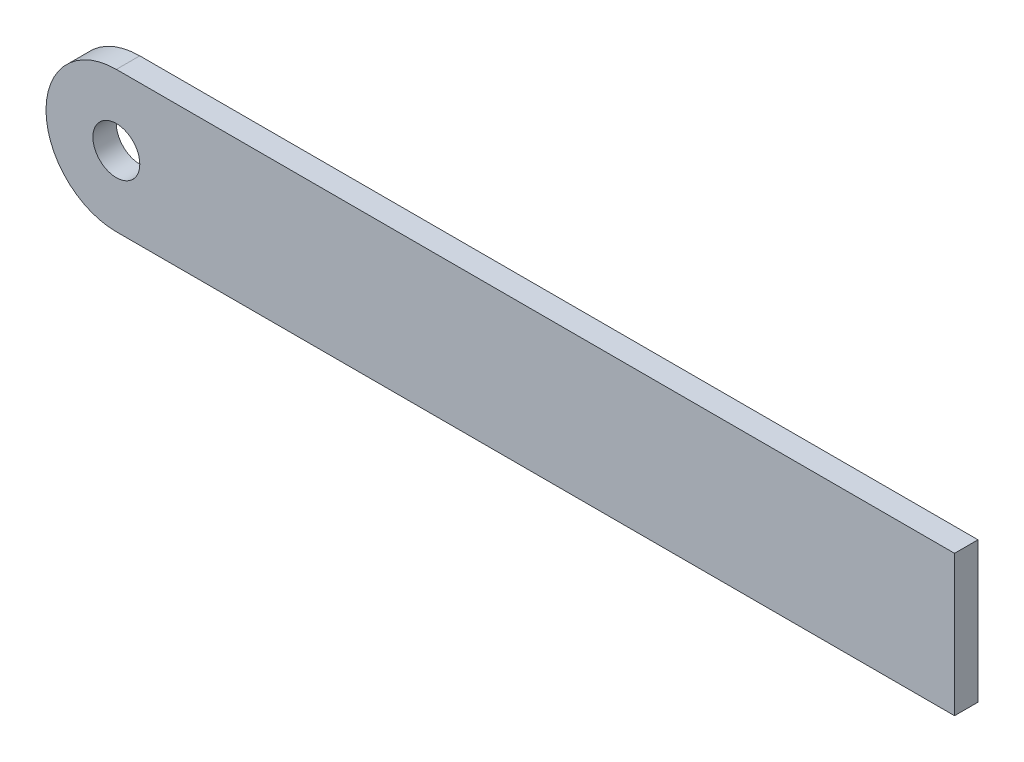
ISO-10303-21;
HEADER;
FILE_DESCRIPTION(('STEP AP214'),'2;1');
FILE_NAME('part.step','',(''),(''),'','','');
FILE_SCHEMA(('AUTOMOTIVE_DESIGN { 1 0 10303 214 1 1 1 1 }'));
ENDSEC;
DATA;
#1=APPLICATION_CONTEXT('core data for automotive mechanical design processes');
#2=APPLICATION_PROTOCOL_DEFINITION('international standard','automotive_design',2000,#1);
#3=PRODUCT_CONTEXT('',#1,'mechanical');
#4=PRODUCT('Part','Part','',(#3));
#5=PRODUCT_RELATED_PRODUCT_CATEGORY('part','',(#4));
#6=PRODUCT_DEFINITION_FORMATION('','',#4);
#7=PRODUCT_DEFINITION_CONTEXT('part definition',#1,'design');
#8=PRODUCT_DEFINITION('design','',#6,#7);
#9=PRODUCT_DEFINITION_SHAPE('','',#8);
#10=(LENGTH_UNIT() NAMED_UNIT(*) SI_UNIT(.MILLI.,.METRE.));
#11=(NAMED_UNIT(*) PLANE_ANGLE_UNIT() SI_UNIT($,.RADIAN.));
#12=(NAMED_UNIT(*) SI_UNIT($,.STERADIAN.) SOLID_ANGLE_UNIT());
#13=UNCERTAINTY_MEASURE_WITH_UNIT(LENGTH_MEASURE(1.E-05),#10,'distance_accuracy_value','');
#14=(GEOMETRIC_REPRESENTATION_CONTEXT(3) GLOBAL_UNCERTAINTY_ASSIGNED_CONTEXT((#13)) GLOBAL_UNIT_ASSIGNED_CONTEXT((#10,
#11,#12)) REPRESENTATION_CONTEXT('',''));
#15=CARTESIAN_POINT('',(0.,0.,0.));
#16=DIRECTION('',(0.,0.,1.));
#17=DIRECTION('',(1.,0.,0.));
#18=AXIS2_PLACEMENT_3D('',#15,#16,#17);
#19=CARTESIAN_POINT('',(-71.5,0.,2.));
#20=DIRECTION('',(0.,0.,1.));
#21=DIRECTION('',(1.,0.,0.));
#22=AXIS2_PLACEMENT_3D('',#19,#20,#21);
#23=PLANE('',#22);
#24=DIRECTION('',(0.,-1.,0.));
#25=VECTOR('',#24,1.);
#26=CARTESIAN_POINT('',(0.,0.,2.));
#27=LINE('',#26,#25);
#28=CARTESIAN_POINT('',(0.,6.00000000000001,2.));
#29=VERTEX_POINT('',#28);
#30=CARTESIAN_POINT('',(0.,-6.,2.));
#31=VERTEX_POINT('',#30);
#32=EDGE_CURVE('E125',#29,#31,#27,.T.);
#33=ORIENTED_EDGE('',*,*,#32,.F.);
#34=DIRECTION('',(-1.,0.,0.));
#35=VECTOR('',#34,1.);
#36=CARTESIAN_POINT('',(-71.5,6.,2.));
#37=LINE('',#36,#35);
#38=CARTESIAN_POINT('',(-71.5,6.,2.));
#39=VERTEX_POINT('',#38);
#40=EDGE_CURVE('E62',#29,#39,#37,.T.);
#41=ORIENTED_EDGE('',*,*,#40,.T.);
#42=CARTESIAN_POINT('',(-71.5,0.,2.));
#43=DIRECTION('',(0.,0.,1.));
#44=DIRECTION('',(1.,0.,0.));
#45=AXIS2_PLACEMENT_3D('',#42,#43,#44);
#46=CIRCLE('',#45,6.);
#47=CARTESIAN_POINT('',(-71.5,-6.,2.));
#48=VERTEX_POINT('',#47);
#49=EDGE_CURVE('E83',#39,#48,#46,.T.);
#50=ORIENTED_EDGE('',*,*,#49,.T.);
#51=DIRECTION('',(1.,0.,0.));
#52=VECTOR('',#51,1.);
#53=CARTESIAN_POINT('',(-71.5,-6.,2.));
#54=LINE('',#53,#52);
#55=EDGE_CURVE('E113',#48,#31,#54,.T.);
#56=ORIENTED_EDGE('',*,*,#55,.T.);
#57=EDGE_LOOP('',(#33,#41,#50,#56));
#58=FACE_BOUND('',#57,.T.);
#59=CARTESIAN_POINT('',(-71.5,0.,2.));
#60=DIRECTION('',(0.,0.,1.));
#61=DIRECTION('',(1.,0.,0.));
#62=AXIS2_PLACEMENT_3D('',#59,#60,#61);
#63=CIRCLE('',#62,2.);
#64=CARTESIAN_POINT('',(-69.5,0.,2.));
#65=VERTEX_POINT('',#64);
#66=EDGE_CURVE('E97',#65,#65,#63,.T.);
#67=ORIENTED_EDGE('',*,*,#66,.F.);
#68=EDGE_LOOP('',(#67));
#69=FACE_BOUND('',#68,.T.);
#70=ADVANCED_FACE('F38',(#58,#69),#23,.T.);
#71=CARTESIAN_POINT('',(-71.5,0.,0.));
#72=DIRECTION('',(0.,0.,1.));
#73=DIRECTION('',(1.,0.,0.));
#74=AXIS2_PLACEMENT_3D('',#71,#72,#73);
#75=PLANE('',#74);
#76=DIRECTION('',(-1.,0.,0.));
#77=VECTOR('',#76,1.);
#78=CARTESIAN_POINT('',(-71.5,6.,0.));
#79=LINE('',#78,#77);
#80=CARTESIAN_POINT('',(0.,6.00000000000001,0.));
#81=VERTEX_POINT('',#80);
#82=CARTESIAN_POINT('',(-71.5,6.,0.));
#83=VERTEX_POINT('',#82);
#84=EDGE_CURVE('E75',#81,#83,#79,.T.);
#85=ORIENTED_EDGE('',*,*,#84,.F.);
#86=DIRECTION('',(0.,-1.,0.));
#87=VECTOR('',#86,1.);
#88=CARTESIAN_POINT('',(0.,-13.9814164226095,0.));
#89=LINE('',#88,#87);
#90=CARTESIAN_POINT('',(0.,-5.99999999999998,0.));
#91=VERTEX_POINT('',#90);
#92=EDGE_CURVE('E54',#81,#91,#89,.T.);
#93=ORIENTED_EDGE('',*,*,#92,.T.);
#94=DIRECTION('',(1.,0.,0.));
#95=VECTOR('',#94,1.);
#96=CARTESIAN_POINT('',(-71.5,-6.,0.));
#97=LINE('',#96,#95);
#98=CARTESIAN_POINT('',(-71.5,-6.,0.));
#99=VERTEX_POINT('',#98);
#100=EDGE_CURVE('E84',#99,#91,#97,.T.);
#101=ORIENTED_EDGE('',*,*,#100,.F.);
#102=CARTESIAN_POINT('',(-71.5,0.,0.));
#103=DIRECTION('',(0.,0.,1.));
#104=DIRECTION('',(1.,0.,0.));
#105=AXIS2_PLACEMENT_3D('',#102,#103,#104);
#106=CIRCLE('',#105,6.);
#107=EDGE_CURVE('E89',#83,#99,#106,.T.);
#108=ORIENTED_EDGE('',*,*,#107,.F.);
#109=EDGE_LOOP('',(#85,#93,#101,#108));
#110=FACE_BOUND('',#109,.T.);
#111=CARTESIAN_POINT('',(-71.5,0.,0.));
#112=DIRECTION('',(0.,0.,1.));
#113=DIRECTION('',(1.,0.,0.));
#114=AXIS2_PLACEMENT_3D('',#111,#112,#113);
#115=CIRCLE('',#114,2.);
#116=CARTESIAN_POINT('',(-69.5,0.,0.));
#117=VERTEX_POINT('',#116);
#118=EDGE_CURVE('E103',#117,#117,#115,.T.);
#119=ORIENTED_EDGE('',*,*,#118,.T.);
#120=EDGE_LOOP('',(#119));
#121=FACE_BOUND('',#120,.T.);
#122=ADVANCED_FACE('F92',(#110,#121),#75,.F.);
#123=CARTESIAN_POINT('',(-71.5,0.,2.));
#124=DIRECTION('',(0.,0.,-1.));
#125=DIRECTION('',(-1.,0.,0.));
#126=AXIS2_PLACEMENT_3D('',#123,#124,#125);
#127=CYLINDRICAL_SURFACE('',#126,6.);
#128=ORIENTED_EDGE('',*,*,#107,.T.);
#129=DIRECTION('',(0.,0.,-1.));
#130=VECTOR('',#129,1.);
#131=CARTESIAN_POINT('',(-71.5,-6.,2.));
#132=LINE('',#131,#130);
#133=EDGE_CURVE('E47',#48,#99,#132,.T.);
#134=ORIENTED_EDGE('',*,*,#133,.F.);
#135=ORIENTED_EDGE('',*,*,#49,.F.);
#136=DIRECTION('',(0.,0.,-1.));
#137=VECTOR('',#136,1.);
#138=CARTESIAN_POINT('',(-71.5,6.,2.));
#139=LINE('',#138,#137);
#140=EDGE_CURVE('E78',#39,#83,#139,.T.);
#141=ORIENTED_EDGE('',*,*,#140,.T.);
#142=EDGE_LOOP('',(#128,#134,#135,#141));
#143=FACE_BOUND('',#142,.T.);
#144=ADVANCED_FACE('F40',(#143),#127,.T.);
#145=CARTESIAN_POINT('',(-71.5,-6.,2.));
#146=DIRECTION('',(0.,1.,0.));
#147=DIRECTION('',(-1.,0.,0.));
#148=AXIS2_PLACEMENT_3D('',#145,#146,#147);
#149=PLANE('',#148);
#150=ORIENTED_EDGE('',*,*,#100,.T.);
#151=DIRECTION('',(0.,0.,1.));
#152=VECTOR('',#151,1.);
#153=CARTESIAN_POINT('',(0.,-5.99999999999999,2.));
#154=LINE('',#153,#152);
#155=EDGE_CURVE('E114',#91,#31,#154,.T.);
#156=ORIENTED_EDGE('',*,*,#155,.T.);
#157=ORIENTED_EDGE('',*,*,#55,.F.);
#158=ORIENTED_EDGE('',*,*,#133,.T.);
#159=EDGE_LOOP('',(#150,#156,#157,#158));
#160=FACE_BOUND('',#159,.T.);
#161=ADVANCED_FACE('F109',(#160),#149,.F.);
#162=CARTESIAN_POINT('',(-71.5,6.,2.));
#163=DIRECTION('',(0.,-1.,0.));
#164=DIRECTION('',(1.,0.,0.));
#165=AXIS2_PLACEMENT_3D('',#162,#163,#164);
#166=PLANE('',#165);
#167=ORIENTED_EDGE('',*,*,#40,.F.);
#168=DIRECTION('',(0.,0.,-1.));
#169=VECTOR('',#168,1.);
#170=CARTESIAN_POINT('',(0.,6.00000000000001,2.));
#171=LINE('',#170,#169);
#172=EDGE_CURVE('E11',#29,#81,#171,.T.);
#173=ORIENTED_EDGE('',*,*,#172,.T.);
#174=ORIENTED_EDGE('',*,*,#84,.T.);
#175=ORIENTED_EDGE('',*,*,#140,.F.);
#176=EDGE_LOOP('',(#167,#173,#174,#175));
#177=FACE_BOUND('',#176,.T.);
#178=ADVANCED_FACE('F77',(#177),#166,.F.);
#179=CARTESIAN_POINT('',(-71.5,0.,2.));
#180=DIRECTION('',(0.,0.,-1.));
#181=DIRECTION('',(-1.,0.,0.));
#182=AXIS2_PLACEMENT_3D('',#179,#180,#181);
#183=CYLINDRICAL_SURFACE('',#182,2.);
#184=ORIENTED_EDGE('',*,*,#66,.T.);
#185=EDGE_LOOP('',(#184));
#186=FACE_BOUND('',#185,.T.);
#187=ORIENTED_EDGE('',*,*,#118,.F.);
#188=EDGE_LOOP('',(#187));
#189=FACE_BOUND('',#188,.T.);
#190=ADVANCED_FACE('F136',(#186,#189),#183,.F.);
#191=CARTESIAN_POINT('',(0.,0.,0.));
#192=DIRECTION('',(-1.,0.,0.));
#193=DIRECTION('',(0.,0.,1.));
#194=AXIS2_PLACEMENT_3D('',#191,#192,#193);
#195=PLANE('',#194);
#196=ORIENTED_EDGE('',*,*,#92,.F.);
#197=ORIENTED_EDGE('',*,*,#172,.F.);
#198=ORIENTED_EDGE('',*,*,#32,.T.);
#199=ORIENTED_EDGE('',*,*,#155,.F.);
#200=EDGE_LOOP('',(#196,#197,#198,#199));
#201=FACE_BOUND('',#200,.T.);
#202=ADVANCED_FACE('F133',(#201),#195,.F.);
#203=CLOSED_SHELL('',(#70,#122,#144,#161,#178,#190,#202));
#204=MANIFOLD_SOLID_BREP('B2',#203);
#205=ADVANCED_BREP_SHAPE_REPRESENTATION('',(#18,#204),#14);
#206=SHAPE_DEFINITION_REPRESENTATION(#9,#205);
ENDSEC;
END-ISO-10303-21;
